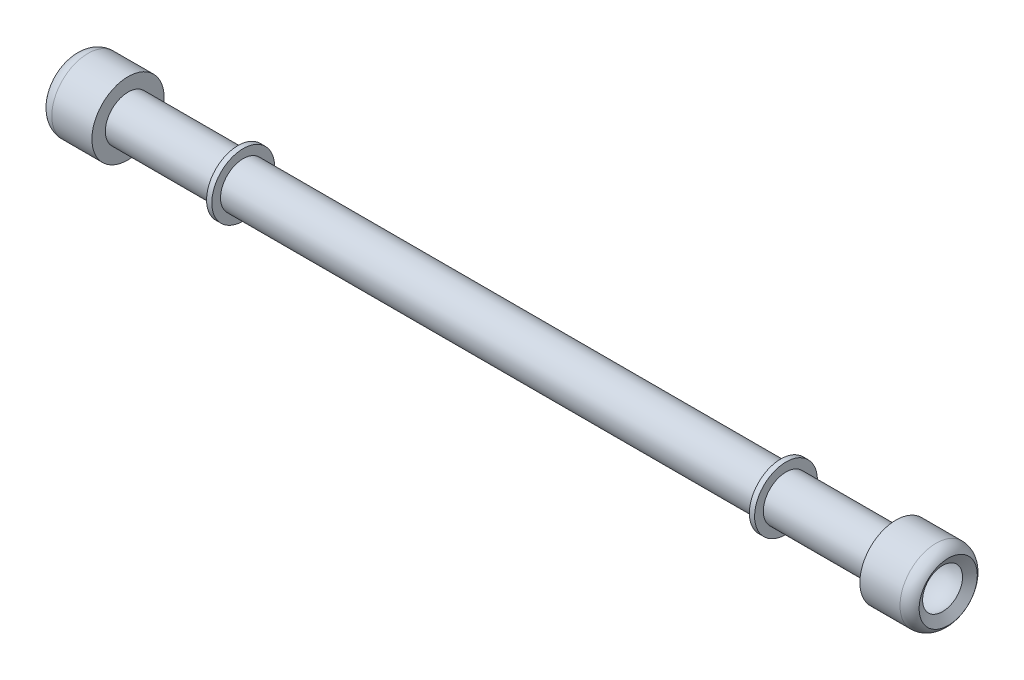
ISO-10303-21;
HEADER;
FILE_DESCRIPTION(('STEP AP214'),'2;1');
FILE_NAME('part.step','',(''),(''),'','','');
FILE_SCHEMA(('AUTOMOTIVE_DESIGN { 1 0 10303 214 1 1 1 1 }'));
ENDSEC;
DATA;
#1=APPLICATION_CONTEXT('core data for automotive mechanical design processes');
#2=APPLICATION_PROTOCOL_DEFINITION('international standard','automotive_design',2000,#1);
#3=PRODUCT_CONTEXT('',#1,'mechanical');
#4=PRODUCT('Part','Part','',(#3));
#5=PRODUCT_RELATED_PRODUCT_CATEGORY('part','',(#4));
#6=PRODUCT_DEFINITION_FORMATION('','',#4);
#7=PRODUCT_DEFINITION_CONTEXT('part definition',#1,'design');
#8=PRODUCT_DEFINITION('design','',#6,#7);
#9=PRODUCT_DEFINITION_SHAPE('','',#8);
#10=(LENGTH_UNIT() NAMED_UNIT(*) SI_UNIT(.MILLI.,.METRE.));
#11=(NAMED_UNIT(*) PLANE_ANGLE_UNIT() SI_UNIT($,.RADIAN.));
#12=(NAMED_UNIT(*) SI_UNIT($,.STERADIAN.) SOLID_ANGLE_UNIT());
#13=UNCERTAINTY_MEASURE_WITH_UNIT(LENGTH_MEASURE(1.E-05),#10,'distance_accuracy_value','');
#14=(GEOMETRIC_REPRESENTATION_CONTEXT(3) GLOBAL_UNCERTAINTY_ASSIGNED_CONTEXT((#13)) GLOBAL_UNIT_ASSIGNED_CONTEXT((#10,
#11,#12)) REPRESENTATION_CONTEXT('',''));
#15=CARTESIAN_POINT('',(0.,0.,0.));
#16=DIRECTION('',(0.,0.,1.));
#17=DIRECTION('',(1.,0.,0.));
#18=AXIS2_PLACEMENT_3D('',#15,#16,#17);
#19=CARTESIAN_POINT('',(220.639440017683,88.4268991587526,1407.2355645497));
#20=DIRECTION('',(-1.,0.,0.));
#21=DIRECTION('',(0.,1.,0.));
#22=AXIS2_PLACEMENT_3D('',#19,#20,#21);
#23=CYLINDRICAL_SURFACE('',#22,13.);
#24=CARTESIAN_POINT('',(154.639440017683,88.4268991587526,1407.2355645497));
#25=DIRECTION('',(1.,0.,0.));
#26=DIRECTION('',(0.,-1.,0.));
#27=AXIS2_PLACEMENT_3D('',#24,#25,#26);
#28=CIRCLE('',#27,13.);
#29=CARTESIAN_POINT('',(154.639440017683,75.4268991587526,1407.2355645497));
#30=VERTEX_POINT('',#29);
#31=EDGE_CURVE('E78',#30,#30,#28,.T.);
#32=ORIENTED_EDGE('',*,*,#31,.F.);
#33=EDGE_LOOP('',(#32));
#34=FACE_BOUND('',#33,.T.);
#35=CARTESIAN_POINT('',(-153.360559982317,88.4268991587526,1407.2355645497));
#36=DIRECTION('',(-1.,0.,0.));
#37=DIRECTION('',(0.,1.,0.));
#38=AXIS2_PLACEMENT_3D('',#35,#36,#37);
#39=CIRCLE('',#38,13.);
#40=CARTESIAN_POINT('',(-153.360559982317,101.426899158753,1407.2355645497));
#41=VERTEX_POINT('',#40);
#42=EDGE_CURVE('E10',#41,#41,#39,.T.);
#43=ORIENTED_EDGE('',*,*,#42,.F.);
#44=EDGE_LOOP('',(#43));
#45=FACE_BOUND('',#44,.T.);
#46=ADVANCED_FACE('F47',(#34,#45),#23,.T.);
#47=CARTESIAN_POINT('',(157.639440017683,88.4268991587526,1407.2355645497));
#48=DIRECTION('',(1.,0.,0.));
#49=DIRECTION('',(0.,-1.,0.));
#50=AXIS2_PLACEMENT_3D('',#47,#48,#49);
#51=CIRCLE('',#50,13.);
#52=CARTESIAN_POINT('',(157.639440017683,75.4268991587526,1407.2355645497));
#53=VERTEX_POINT('',#52);
#54=EDGE_CURVE('E79',#53,#53,#51,.T.);
#55=ORIENTED_EDGE('',*,*,#54,.T.);
#56=EDGE_LOOP('',(#55));
#57=FACE_BOUND('',#56,.T.);
#58=CARTESIAN_POINT('',(220.639440017683,88.4268991587526,1407.2355645497));
#59=DIRECTION('',(1.,0.,0.));
#60=DIRECTION('',(0.,-1.,0.));
#61=AXIS2_PLACEMENT_3D('',#58,#59,#60);
#62=CIRCLE('',#61,13.);
#63=CARTESIAN_POINT('',(220.639440017683,75.4268991587526,1407.2355645497));
#64=VERTEX_POINT('',#63);
#65=EDGE_CURVE('E98',#64,#64,#62,.T.);
#66=ORIENTED_EDGE('',*,*,#65,.F.);
#67=EDGE_LOOP('',(#66));
#68=FACE_BOUND('',#67,.T.);
#69=ADVANCED_FACE('F152',(#57,#68),#23,.T.);
#70=CARTESIAN_POINT('',(251.639440017683,88.4268991587526,1407.2355645497));
#71=DIRECTION('',(-1.,0.,0.));
#72=DIRECTION('',(0.,1.,0.));
#73=AXIS2_PLACEMENT_3D('',#70,#71,#72);
#74=CYLINDRICAL_SURFACE('',#73,20.690094219506);
#75=CARTESIAN_POINT('',(243.639440017683,88.4268991587526,1407.2355645497));
#76=DIRECTION('',(1.,0.,0.));
#77=DIRECTION('',(0.,-1.,0.));
#78=AXIS2_PLACEMENT_3D('',#75,#76,#77);
#79=CIRCLE('',#78,20.690094219506);
#80=CARTESIAN_POINT('',(243.639440017683,67.7368049392466,1407.2355645497));
#81=VERTEX_POINT('',#80);
#82=EDGE_CURVE('E94',#81,#81,#79,.F.);
#83=ORIENTED_EDGE('',*,*,#82,.T.);
#84=EDGE_LOOP('',(#83));
#85=FACE_BOUND('',#84,.T.);
#86=CARTESIAN_POINT('',(220.639440017683,88.4268991587526,1407.2355645497));
#87=DIRECTION('',(1.,0.,0.));
#88=DIRECTION('',(0.,-1.,0.));
#89=AXIS2_PLACEMENT_3D('',#86,#87,#88);
#90=CIRCLE('',#89,20.690094219506);
#91=CARTESIAN_POINT('',(220.639440017683,67.7368049392466,1407.2355645497));
#92=VERTEX_POINT('',#91);
#93=EDGE_CURVE('E83',#92,#92,#90,.T.);
#94=ORIENTED_EDGE('',*,*,#93,.T.);
#95=EDGE_LOOP('',(#94));
#96=FACE_BOUND('',#95,.T.);
#97=ADVANCED_FACE('F159',(#85,#96),#74,.T.);
#98=CARTESIAN_POINT('',(220.639440017683,88.4268991587526,1407.2355645497));
#99=DIRECTION('',(1.,0.,0.));
#100=DIRECTION('',(0.,-1.,0.));
#101=AXIS2_PLACEMENT_3D('',#98,#99,#100);
#102=PLANE('',#101);
#103=ORIENTED_EDGE('',*,*,#65,.T.);
#104=EDGE_LOOP('',(#103));
#105=FACE_BOUND('',#104,.T.);
#106=ORIENTED_EDGE('',*,*,#93,.F.);
#107=EDGE_LOOP('',(#106));
#108=FACE_BOUND('',#107,.T.);
#109=ADVANCED_FACE('F204',(#105,#108),#102,.F.);
#110=CARTESIAN_POINT('',(243.639440017683,88.4268991587526,1407.2355645497));
#111=DIRECTION('',(1.,0.,0.));
#112=DIRECTION('',(0.,-1.,0.));
#113=AXIS2_PLACEMENT_3D('',#110,#111,#112);
#114=TOROIDAL_SURFACE('',#113,12.690094219506,8.);
#115=CARTESIAN_POINT('',(250.578093304479,88.4268991587526,1407.2355645497));
#116=DIRECTION('',(-1.,0.,0.));
#117=DIRECTION('',(0.,1.,0.));
#118=AXIS2_PLACEMENT_3D('',#115,#116,#117);
#119=CIRCLE('',#118,16.6719393402556);
#120=CARTESIAN_POINT('',(250.578093304479,105.098838499008,1407.2355645497));
#121=VERTEX_POINT('',#120);
#122=EDGE_CURVE('E87',#121,#121,#119,.T.);
#123=ORIENTED_EDGE('',*,*,#122,.T.);
#124=EDGE_LOOP('',(#123));
#125=FACE_BOUND('',#124,.T.);
#126=ORIENTED_EDGE('',*,*,#82,.F.);
#127=EDGE_LOOP('',(#126));
#128=FACE_BOUND('',#127,.T.);
#129=ADVANCED_FACE('F202',(#125,#128),#114,.T.);
#130=CARTESIAN_POINT('',(237.639440017683,88.4268991587526,1407.2355645497));
#131=DIRECTION('',(0.,-1.,0.));
#132=DIRECTION('',(0.,0.,-1.));
#133=AXIS2_PLACEMENT_3D('',#130,#131,#132);
#134=SPHERICAL_SURFACE('',#133,15.);
#135=CARTESIAN_POINT('',(237.639440017683,88.4268991587526,1407.2355645497));
#136=DIRECTION('',(-1.,0.,0.));
#137=DIRECTION('',(0.,1.,0.));
#138=AXIS2_PLACEMENT_3D('',#135,#136,#137);
#139=SPHERICAL_SURFACE('',#138,15.);
#140=CARTESIAN_POINT('',(247.338795759487,88.4268991587526,1407.2355645497));
#141=DIRECTION('',(-1.,0.,0.));
#142=DIRECTION('',(0.,1.,0.));
#143=AXIS2_PLACEMENT_3D('',#140,#141,#142);
#144=CIRCLE('',#143,11.4421369592376);
#145=CARTESIAN_POINT('',(247.338795759487,99.8690361179901,1407.2355645497));
#146=VERTEX_POINT('',#145);
#147=EDGE_CURVE('E90',#146,#146,#144,.F.);
#148=ORIENTED_EDGE('',*,*,#147,.T.);
#149=EDGE_LOOP('',(#148));
#150=FACE_BOUND('',#149,.T.);
#151=ADVANCED_FACE('F199',(#150),#139,.F.);
#152=CARTESIAN_POINT('',(247.338795759487,88.4268991587526,1407.2355645497));
#153=DIRECTION('',(1.,0.,0.));
#154=DIRECTION('',(0.,-1.,0.));
#155=AXIS2_PLACEMENT_3D('',#152,#153,#154);
#156=CONICAL_SURFACE('',#155,11.4421369592376,1.01623992768622);
#157=ORIENTED_EDGE('',*,*,#122,.F.);
#158=EDGE_LOOP('',(#157));
#159=FACE_BOUND('',#158,.T.);
#160=ORIENTED_EDGE('',*,*,#147,.F.);
#161=EDGE_LOOP('',(#160));
#162=FACE_BOUND('',#161,.T.);
#163=ADVANCED_FACE('F197',(#159,#162),#156,.F.);
#164=CARTESIAN_POINT('',(157.639440017683,88.4268991587526,1407.2355645497));
#165=DIRECTION('',(-1.,0.,0.));
#166=DIRECTION('',(0.,1.,0.));
#167=AXIS2_PLACEMENT_3D('',#164,#165,#166);
#168=CYLINDRICAL_SURFACE('',#167,18.);
#169=CARTESIAN_POINT('',(157.639440017683,88.4268991587526,1407.2355645497));
#170=DIRECTION('',(1.,0.,0.));
#171=DIRECTION('',(0.,-1.,0.));
#172=AXIS2_PLACEMENT_3D('',#169,#170,#171);
#173=CIRCLE('',#172,18.);
#174=CARTESIAN_POINT('',(157.639440017683,70.4268991587526,1407.2355645497));
#175=VERTEX_POINT('',#174);
#176=EDGE_CURVE('E84',#175,#175,#173,.T.);
#177=ORIENTED_EDGE('',*,*,#176,.F.);
#178=EDGE_LOOP('',(#177));
#179=FACE_BOUND('',#178,.T.);
#180=CARTESIAN_POINT('',(154.639440017683,88.4268991587526,1407.2355645497));
#181=DIRECTION('',(1.,0.,0.));
#182=DIRECTION('',(0.,-1.,0.));
#183=AXIS2_PLACEMENT_3D('',#180,#181,#182);
#184=CIRCLE('',#183,18.);
#185=CARTESIAN_POINT('',(154.639440017683,70.4268991587526,1407.2355645497));
#186=VERTEX_POINT('',#185);
#187=EDGE_CURVE('E103',#186,#186,#184,.T.);
#188=ORIENTED_EDGE('',*,*,#187,.T.);
#189=EDGE_LOOP('',(#188));
#190=FACE_BOUND('',#189,.T.);
#191=ADVANCED_FACE('F190',(#179,#190),#168,.T.);
#192=CARTESIAN_POINT('',(157.639440017683,88.4268991587526,1407.2355645497));
#193=DIRECTION('',(1.,0.,0.));
#194=DIRECTION('',(0.,-1.,0.));
#195=AXIS2_PLACEMENT_3D('',#192,#193,#194);
#196=PLANE('',#195);
#197=ORIENTED_EDGE('',*,*,#54,.F.);
#198=EDGE_LOOP('',(#197));
#199=FACE_BOUND('',#198,.T.);
#200=ORIENTED_EDGE('',*,*,#176,.T.);
#201=EDGE_LOOP('',(#200));
#202=FACE_BOUND('',#201,.T.);
#203=ADVANCED_FACE('F187',(#199,#202),#196,.T.);
#204=CARTESIAN_POINT('',(154.639440017683,88.4268991587526,1407.2355645497));
#205=DIRECTION('',(1.,0.,0.));
#206=DIRECTION('',(0.,-1.,0.));
#207=AXIS2_PLACEMENT_3D('',#204,#205,#206);
#208=PLANE('',#207);
#209=ORIENTED_EDGE('',*,*,#31,.T.);
#210=EDGE_LOOP('',(#209));
#211=FACE_BOUND('',#210,.T.);
#212=ORIENTED_EDGE('',*,*,#187,.F.);
#213=EDGE_LOOP('',(#212));
#214=FACE_BOUND('',#213,.T.);
#215=ADVANCED_FACE('F149',(#211,#214),#208,.F.);
#216=CARTESIAN_POINT('',(-156.360559982317,88.4268991587526,1407.2355645497));
#217=DIRECTION('',(1.,0.,0.));
#218=DIRECTION('',(0.,-1.,0.));
#219=AXIS2_PLACEMENT_3D('',#216,#217,#218);
#220=CYLINDRICAL_SURFACE('',#219,18.);
#221=CARTESIAN_POINT('',(-156.360559982317,88.4268991587526,1407.2355645497));
#222=DIRECTION('',(1.,0.,0.));
#223=DIRECTION('',(0.,-1.,0.));
#224=AXIS2_PLACEMENT_3D('',#221,#222,#223);
#225=CIRCLE('',#224,18.);
#226=CARTESIAN_POINT('',(-156.360559982317,70.4268991587526,1407.2355645497));
#227=VERTEX_POINT('',#226);
#228=EDGE_CURVE('E124',#227,#227,#225,.T.);
#229=ORIENTED_EDGE('',*,*,#228,.T.);
#230=EDGE_LOOP('',(#229));
#231=FACE_BOUND('',#230,.T.);
#232=CARTESIAN_POINT('',(-153.360559982317,88.4268991587526,1407.2355645497));
#233=DIRECTION('',(1.,0.,0.));
#234=DIRECTION('',(0.,-1.,0.));
#235=AXIS2_PLACEMENT_3D('',#232,#233,#234);
#236=CIRCLE('',#235,18.);
#237=CARTESIAN_POINT('',(-153.360559982317,70.4268991587526,1407.2355645497));
#238=VERTEX_POINT('',#237);
#239=EDGE_CURVE('E120',#238,#238,#236,.T.);
#240=ORIENTED_EDGE('',*,*,#239,.F.);
#241=EDGE_LOOP('',(#240));
#242=FACE_BOUND('',#241,.T.);
#243=ADVANCED_FACE('F140',(#231,#242),#220,.T.);
#244=CARTESIAN_POINT('',(-156.360559982317,88.4268991587526,1407.2355645497));
#245=DIRECTION('',(-1.,0.,0.));
#246=DIRECTION('',(0.,-1.,0.));
#247=AXIS2_PLACEMENT_3D('',#244,#245,#246);
#248=PLANE('',#247);
#249=CARTESIAN_POINT('',(-156.360559982317,88.4268991587526,1407.2355645497));
#250=DIRECTION('',(-1.,0.,0.));
#251=DIRECTION('',(0.,1.,0.));
#252=AXIS2_PLACEMENT_3D('',#249,#250,#251);
#253=CIRCLE('',#252,13.);
#254=CARTESIAN_POINT('',(-156.360559982317,101.426899158753,1407.2355645497));
#255=VERTEX_POINT('',#254);
#256=EDGE_CURVE('E52',#255,#255,#253,.T.);
#257=ORIENTED_EDGE('',*,*,#256,.F.);
#258=EDGE_LOOP('',(#257));
#259=FACE_BOUND('',#258,.T.);
#260=ORIENTED_EDGE('',*,*,#228,.F.);
#261=EDGE_LOOP('',(#260));
#262=FACE_BOUND('',#261,.T.);
#263=ADVANCED_FACE('F136',(#259,#262),#248,.T.);
#264=CARTESIAN_POINT('',(-153.360559982317,88.4268991587526,1407.2355645497));
#265=DIRECTION('',(-1.,0.,0.));
#266=DIRECTION('',(0.,-1.,0.));
#267=AXIS2_PLACEMENT_3D('',#264,#265,#266);
#268=PLANE('',#267);
#269=ORIENTED_EDGE('',*,*,#42,.T.);
#270=EDGE_LOOP('',(#269));
#271=FACE_BOUND('',#270,.T.);
#272=ORIENTED_EDGE('',*,*,#239,.T.);
#273=EDGE_LOOP('',(#272));
#274=FACE_BOUND('',#273,.T.);
#275=ADVANCED_FACE('F139',(#271,#274),#268,.F.);
#276=CARTESIAN_POINT('',(-236.360559982317,88.4268991587526,1407.2355645497));
#277=DIRECTION('',(0.,-1.,0.));
#278=DIRECTION('',(0.,0.,-1.));
#279=AXIS2_PLACEMENT_3D('',#276,#277,#278);
#280=SPHERICAL_SURFACE('',#279,15.);
#281=CARTESIAN_POINT('',(-236.360559982317,88.4268991587526,1407.2355645497));
#282=DIRECTION('',(1.,0.,0.));
#283=DIRECTION('',(0.,-1.,0.));
#284=AXIS2_PLACEMENT_3D('',#281,#282,#283);
#285=SPHERICAL_SURFACE('',#284,15.);
#286=CARTESIAN_POINT('',(-242.929410971128,88.4268991587526,1407.2355645497));
#287=DIRECTION('',(1.,0.,0.));
#288=DIRECTION('',(0.,-1.,0.));
#289=AXIS2_PLACEMENT_3D('',#286,#287,#288);
#290=CIRCLE('',#289,13.4851843401118);
#291=CARTESIAN_POINT('',(-242.929410971128,74.9417148186408,1407.2355645497));
#292=VERTEX_POINT('',#291);
#293=EDGE_CURVE('E64',#292,#292,#290,.F.);
#294=ORIENTED_EDGE('',*,*,#293,.T.);
#295=EDGE_LOOP('',(#294));
#296=FACE_BOUND('',#295,.T.);
#297=ADVANCED_FACE('F147',(#296),#285,.F.);
#298=CARTESIAN_POINT('',(-242.929410971128,88.4268991587526,1407.2355645497));
#299=DIRECTION('',(1.,0.,0.));
#300=DIRECTION('',(0.,-1.,0.));
#301=AXIS2_PLACEMENT_3D('',#298,#299,#300);
#302=CONICAL_SURFACE('',#301,13.4851843401118,0.313587644342779);
#303=CARTESIAN_POINT('',(-250.360559982317,88.4268991587526,1407.2355645497));
#304=DIRECTION('',(-1.,0.,0.));
#305=DIRECTION('',(0.,1.,0.));
#306=AXIS2_PLACEMENT_3D('',#303,#304,#305);
#307=CIRCLE('',#306,11.0753530423962);
#308=CARTESIAN_POINT('',(-250.360559982317,77.3515461163563,1407.2355645497));
#309=VERTEX_POINT('',#308);
#310=EDGE_CURVE('E57',#309,#309,#307,.F.);
#311=CARTESIAN_POINT('',(-250.360559982317,77.3515461163563,1407.2355645497));
#312=CARTESIAN_POINT('',(-250.283152180117,77.3264437070051,1407.2355645497));
#313=CARTESIAN_POINT('',(-250.205744377917,77.3013412976539,1407.2355645497));
#314=CARTESIAN_POINT('',(-250.050928773517,77.2511364789515,1407.2355645497));
#315=CARTESIAN_POINT('',(-249.973520971317,77.2260340696003,1407.2355645497));
#316=CARTESIAN_POINT('',(-249.818705366917,77.1758292508979,1407.2355645497));
#317=CARTESIAN_POINT('',(-249.741297564718,77.1507268415467,1407.2355645497));
#318=CARTESIAN_POINT('',(-249.586481960318,77.1005220228443,1407.2355645497));
#319=CARTESIAN_POINT('',(-249.509074158118,77.0754196134931,1407.2355645497));
#320=CARTESIAN_POINT('',(-249.354258553718,77.0252147947907,1407.2355645497));
#321=CARTESIAN_POINT('',(-249.276850751518,77.0001123854395,1407.2355645497));
#322=CARTESIAN_POINT('',(-249.122035147118,76.9499075667371,1407.2355645497));
#323=CARTESIAN_POINT('',(-249.044627344919,76.9248051573859,1407.2355645497));
#324=CARTESIAN_POINT('',(-248.889811740519,76.8746003386835,1407.2355645497));
#325=CARTESIAN_POINT('',(-248.812403938319,76.8494979293323,1407.2355645497));
#326=CARTESIAN_POINT('',(-248.657588333919,76.7992931106299,1407.2355645497));
#327=CARTESIAN_POINT('',(-248.580180531719,76.7741907012787,1407.2355645497));
#328=CARTESIAN_POINT('',(-248.42536492732,76.7239858825763,1407.2355645497));
#329=CARTESIAN_POINT('',(-248.34795712512,76.6988834732251,1407.2355645497));
#330=CARTESIAN_POINT('',(-248.19314152072,76.6486786545226,1407.2355645497));
#331=CARTESIAN_POINT('',(-248.11573371852,76.6235762451714,1407.2355645497));
#332=CARTESIAN_POINT('',(-247.96091811412,76.573371426469,1407.2355645497));
#333=CARTESIAN_POINT('',(-247.88351031192,76.5482690171178,1407.2355645497));
#334=CARTESIAN_POINT('',(-247.728694707521,76.4980641984154,1407.2355645497));
#335=CARTESIAN_POINT('',(-247.651286905321,76.4729617890642,1407.2355645497));
#336=CARTESIAN_POINT('',(-247.496471300921,76.4227569703618,1407.2355645497));
#337=CARTESIAN_POINT('',(-247.419063498721,76.3976545610106,1407.2355645497));
#338=CARTESIAN_POINT('',(-247.264247894321,76.3474497423082,1407.2355645497));
#339=CARTESIAN_POINT('',(-247.186840092121,76.322347332957,1407.2355645497));
#340=CARTESIAN_POINT('',(-247.032024487722,76.2721425142546,1407.2355645497));
#341=CARTESIAN_POINT('',(-246.954616685522,76.2470401049034,1407.2355645497));
#342=CARTESIAN_POINT('',(-246.799801081122,76.196835286201,1407.2355645497));
#343=CARTESIAN_POINT('',(-246.722393278922,76.1717328768498,1407.2355645497));
#344=CARTESIAN_POINT('',(-246.567577674522,76.1215280581474,1407.2355645497));
#345=CARTESIAN_POINT('',(-246.490169872322,76.0964256487962,1407.2355645497));
#346=CARTESIAN_POINT('',(-246.335354267923,76.0462208300938,1407.2355645497));
#347=CARTESIAN_POINT('',(-246.257946465723,76.0211184207426,1407.2355645497));
#348=CARTESIAN_POINT('',(-246.103130861323,75.9709136020402,1407.2355645497));
#349=CARTESIAN_POINT('',(-246.025723059123,75.945811192689,1407.2355645497));
#350=CARTESIAN_POINT('',(-245.870907454723,75.8956063739866,1407.2355645497));
#351=CARTESIAN_POINT('',(-245.793499652523,75.8705039646353,1407.2355645497));
#352=CARTESIAN_POINT('',(-245.638684048124,75.8202991459329,1407.2355645497));
#353=CARTESIAN_POINT('',(-245.561276245924,75.7951967365817,1407.2355645497));
#354=CARTESIAN_POINT('',(-245.406460641524,75.7449919178793,1407.2355645497));
#355=CARTESIAN_POINT('',(-245.329052839324,75.7198895085281,1407.2355645497));
#356=CARTESIAN_POINT('',(-245.174237234924,75.6696846898257,1407.2355645497));
#357=CARTESIAN_POINT('',(-245.096829432725,75.6445822804745,1407.2355645497));
#358=CARTESIAN_POINT('',(-244.942013828325,75.5943774617721,1407.2355645497));
#359=CARTESIAN_POINT('',(-244.864606026125,75.5692750524209,1407.2355645497));
#360=CARTESIAN_POINT('',(-244.709790421725,75.5190702337185,1407.2355645497));
#361=CARTESIAN_POINT('',(-244.632382619525,75.4939678243673,1407.2355645497));
#362=CARTESIAN_POINT('',(-244.477567015125,75.4437630056649,1407.2355645497));
#363=CARTESIAN_POINT('',(-244.400159212926,75.4186605963137,1407.2355645497));
#364=CARTESIAN_POINT('',(-244.245343608526,75.3684557776113,1407.2355645497));
#365=CARTESIAN_POINT('',(-244.167935806326,75.3433533682601,1407.2355645497));
#366=CARTESIAN_POINT('',(-244.013120201926,75.2931485495577,1407.2355645497));
#367=CARTESIAN_POINT('',(-243.935712399726,75.2680461402065,1407.2355645497));
#368=CARTESIAN_POINT('',(-243.780896795326,75.2178413215041,1407.2355645497));
#369=CARTESIAN_POINT('',(-243.703488993127,75.1927389121528,1407.2355645497));
#370=CARTESIAN_POINT('',(-243.548673388727,75.1425340934504,1407.2355645497));
#371=CARTESIAN_POINT('',(-243.471265586527,75.1174316840992,1407.2355645497));
#372=CARTESIAN_POINT('',(-243.316449982127,75.0672268653968,1407.2355645497));
#373=CARTESIAN_POINT('',(-243.239042179927,75.0421244560456,1407.2355645497));
#374=CARTESIAN_POINT('',(-243.084226575528,74.9919196373432,1407.2355645497));
#375=CARTESIAN_POINT('',(-243.006818773328,74.966817227992,1407.2355645497));
#376=CARTESIAN_POINT('',(-242.929410971128,74.9417148186408,1407.2355645497));
#377=B_SPLINE_CURVE_WITH_KNOTS('',3,(#311,#312,#313,#314,#315,#316,#317,#318,#319,#320,#321,
#322,#323,#324,#325,#326,#327,#328,#329,#330,#331,#332,#333,#334,#335,#336,#337,#338,#339,#340,
#341,#342,#343,#344,#345,#346,#347,#348,#349,#350,#351,#352,#353,#354,#355,#356,#357,#358,#359,
#360,#361,#362,#363,#364,#365,#366,#367,#368,#369,#370,#371,#372,#373,#374,#375,#376),
.UNSPECIFIED.,.F.,.F.,(4,2,2,2,2,2,2,2,2,2,2,2,2,2,2,2,2,2,2,2,2,2,2,2,2,2,2,2,2,2,2,2,4),(0.,
0.244128837235282,0.488257674470587,0.732386511705922,0.97651534894123,1.22064418617654,
1.46477302341184,1.70890186064715,1.95303069788249,2.1971595351178,2.4412883723531,
2.68541720958841,2.92954604682372,3.17367488405905,3.41780372129436,3.66193255852966,
3.90606139576497,4.15019023300028,4.39431907023561,4.63844790747092,4.88257674470623,
5.12670558194153,5.37083441917684,5.61496325641217,5.85909209364748,6.10322093088279,
6.3473497681181,6.59147860535343,6.83560744258874,7.07973627982405,7.32386511705935,
7.56799395429466,7.81212279153),.UNSPECIFIED.);
#378=EDGE_CURVE('BSEAM50',#309,#292,#377,.T.);
#379=ORIENTED_EDGE('',*,*,#310,.F.);
#380=ORIENTED_EDGE('',*,*,#293,.F.);
#381=ORIENTED_EDGE('',*,*,#378,.T.);
#382=ORIENTED_EDGE('',*,*,#378,.F.);
#383=EDGE_LOOP('',(#379,#381,#380,#382));
#384=FACE_BOUND('',#383,.T.);
#385=ADVANCED_FACE('F50',(#384),#302,.F.);
#386=CARTESIAN_POINT('',(-250.360559982317,88.4268991587526,1407.2355645497));
#387=DIRECTION('',(-1.,0.,0.));
#388=DIRECTION('',(0.,-1.,0.));
#389=AXIS2_PLACEMENT_3D('',#386,#387,#388);
#390=PLANE('',#389);
#391=ORIENTED_EDGE('',*,*,#310,.T.);
#392=EDGE_LOOP('',(#391));
#393=FACE_BOUND('',#392,.T.);
#394=CARTESIAN_POINT('',(-250.360559982317,88.4268991587526,1407.2355645497));
#395=DIRECTION('',(-1.,0.,0.));
#396=DIRECTION('',(0.,1.,0.));
#397=AXIS2_PLACEMENT_3D('',#394,#395,#396);
#398=CIRCLE('',#397,12.690094219506);
#399=CARTESIAN_POINT('',(-250.360559982317,101.116993378259,1407.2355645497));
#400=VERTEX_POINT('',#399);
#401=EDGE_CURVE('E70',#400,#400,#398,.T.);
#402=ORIENTED_EDGE('',*,*,#401,.T.);
#403=EDGE_LOOP('',(#402));
#404=FACE_BOUND('',#403,.T.);
#405=ADVANCED_FACE('F184',(#393,#404),#390,.T.);
#406=CARTESIAN_POINT('',(-242.360559982317,88.4268991587526,1407.2355645497));
#407=DIRECTION('',(-1.,0.,0.));
#408=DIRECTION('',(0.,1.,0.));
#409=AXIS2_PLACEMENT_3D('',#406,#407,#408);
#410=TOROIDAL_SURFACE('',#409,12.690094219506,8.);
#411=ORIENTED_EDGE('',*,*,#401,.F.);
#412=EDGE_LOOP('',(#411));
#413=FACE_BOUND('',#412,.T.);
#414=CARTESIAN_POINT('',(-242.360559982317,88.4268991587526,1407.2355645497));
#415=DIRECTION('',(-1.,0.,0.));
#416=DIRECTION('',(0.,1.,0.));
#417=AXIS2_PLACEMENT_3D('',#414,#415,#416);
#418=CIRCLE('',#417,20.690094219506);
#419=CARTESIAN_POINT('',(-242.360559982317,109.116993378259,1407.2355645497));
#420=VERTEX_POINT('',#419);
#421=EDGE_CURVE('E74',#420,#420,#418,.F.);
#422=ORIENTED_EDGE('',*,*,#421,.F.);
#423=EDGE_LOOP('',(#422));
#424=FACE_BOUND('',#423,.T.);
#425=ADVANCED_FACE('F178',(#413,#424),#410,.T.);
#426=CARTESIAN_POINT('',(-250.360559982317,88.4268991587526,1407.2355645497));
#427=DIRECTION('',(1.,0.,0.));
#428=DIRECTION('',(0.,-1.,0.));
#429=AXIS2_PLACEMENT_3D('',#426,#427,#428);
#430=CYLINDRICAL_SURFACE('',#429,20.690094219506);
#431=ORIENTED_EDGE('',*,*,#421,.T.);
#432=EDGE_LOOP('',(#431));
#433=FACE_BOUND('',#432,.T.);
#434=CARTESIAN_POINT('',(-219.360559982317,88.4268991587526,1407.2355645497));
#435=DIRECTION('',(1.,0.,0.));
#436=DIRECTION('',(0.,-1.,0.));
#437=AXIS2_PLACEMENT_3D('',#434,#435,#436);
#438=CIRCLE('',#437,20.690094219506);
#439=CARTESIAN_POINT('',(-219.360559982317,67.7368049392466,1407.2355645497));
#440=VERTEX_POINT('',#439);
#441=EDGE_CURVE('E104',#440,#440,#438,.T.);
#442=ORIENTED_EDGE('',*,*,#441,.F.);
#443=EDGE_LOOP('',(#442));
#444=FACE_BOUND('',#443,.T.);
#445=ADVANCED_FACE('F171',(#433,#444),#430,.T.);
#446=CARTESIAN_POINT('',(-219.360559982317,88.4268991587526,1407.2355645497));
#447=DIRECTION('',(-1.,0.,0.));
#448=DIRECTION('',(0.,-1.,0.));
#449=AXIS2_PLACEMENT_3D('',#446,#447,#448);
#450=PLANE('',#449);
#451=CARTESIAN_POINT('',(-219.360559982317,88.4268991587526,1407.2355645497));
#452=DIRECTION('',(1.,0.,0.));
#453=DIRECTION('',(0.,-1.,0.));
#454=AXIS2_PLACEMENT_3D('',#451,#452,#453);
#455=CIRCLE('',#454,13.);
#456=CARTESIAN_POINT('',(-219.360559982317,75.4268991587526,1407.2355645497));
#457=VERTEX_POINT('',#456);
#458=EDGE_CURVE('E99',#457,#457,#455,.T.);
#459=ORIENTED_EDGE('',*,*,#458,.F.);
#460=EDGE_LOOP('',(#459));
#461=FACE_BOUND('',#460,.T.);
#462=ORIENTED_EDGE('',*,*,#441,.T.);
#463=EDGE_LOOP('',(#462));
#464=FACE_BOUND('',#463,.T.);
#465=ADVANCED_FACE('F166',(#461,#464),#450,.F.);
#466=ORIENTED_EDGE('',*,*,#256,.T.);
#467=EDGE_LOOP('',(#466));
#468=FACE_BOUND('',#467,.T.);
#469=ORIENTED_EDGE('',*,*,#458,.T.);
#470=EDGE_LOOP('',(#469));
#471=FACE_BOUND('',#470,.T.);
#472=ADVANCED_FACE('F133',(#468,#471),#23,.T.);
#473=CLOSED_SHELL('',(#46,#69,#97,#109,#129,#151,#163,#191,#203,#215,#243,#263,#275,#297,#385,
#405,#425,#445,#465,#472));
#474=MANIFOLD_SOLID_BREP('B2',#473);
#475=ADVANCED_BREP_SHAPE_REPRESENTATION('',(#18,#474),#14);
#476=SHAPE_DEFINITION_REPRESENTATION(#9,#475);
ENDSEC;
END-ISO-10303-21;
